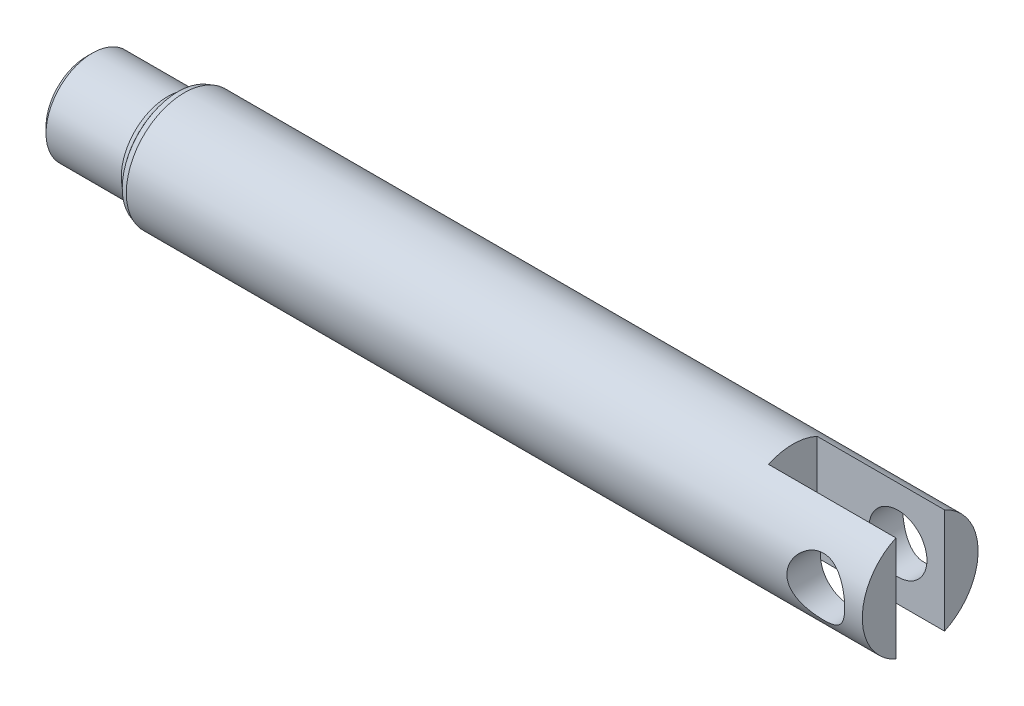
ISO-10303-21;
HEADER;
FILE_DESCRIPTION(('STEP AP214'),'2;1');
FILE_NAME('part.step','',(''),(''),'','','');
FILE_SCHEMA(('AUTOMOTIVE_DESIGN { 1 0 10303 214 1 1 1 1 }'));
ENDSEC;
DATA;
#1=APPLICATION_CONTEXT('core data for automotive mechanical design processes');
#2=APPLICATION_PROTOCOL_DEFINITION('international standard','automotive_design',2000,#1);
#3=PRODUCT_CONTEXT('',#1,'mechanical');
#4=PRODUCT('Part','Part','',(#3));
#5=PRODUCT_RELATED_PRODUCT_CATEGORY('part','',(#4));
#6=PRODUCT_DEFINITION_FORMATION('','',#4);
#7=PRODUCT_DEFINITION_CONTEXT('part definition',#1,'design');
#8=PRODUCT_DEFINITION('design','',#6,#7);
#9=PRODUCT_DEFINITION_SHAPE('','',#8);
#10=(LENGTH_UNIT() NAMED_UNIT(*) SI_UNIT(.MILLI.,.METRE.));
#11=(NAMED_UNIT(*) PLANE_ANGLE_UNIT() SI_UNIT($,.RADIAN.));
#12=(NAMED_UNIT(*) SI_UNIT($,.STERADIAN.) SOLID_ANGLE_UNIT());
#13=UNCERTAINTY_MEASURE_WITH_UNIT(LENGTH_MEASURE(1.E-05),#10,'distance_accuracy_value','');
#14=(GEOMETRIC_REPRESENTATION_CONTEXT(3) GLOBAL_UNCERTAINTY_ASSIGNED_CONTEXT((#13)) GLOBAL_UNIT_ASSIGNED_CONTEXT((#10,
#11,#12)) REPRESENTATION_CONTEXT('',''));
#15=CARTESIAN_POINT('',(0.,0.,0.));
#16=DIRECTION('',(0.,0.,1.));
#17=DIRECTION('',(1.,0.,0.));
#18=AXIS2_PLACEMENT_3D('',#15,#16,#17);
#19=CARTESIAN_POINT('',(18.,2.5,0.));
#20=DIRECTION('',(1.,0.,0.));
#21=DIRECTION('',(0.,0.,-1.));
#22=AXIS2_PLACEMENT_3D('',#19,#20,#21);
#23=PLANE('',#22);
#24=DIRECTION('',(0.,1.,0.));
#25=VECTOR('',#24,1.);
#26=CARTESIAN_POINT('',(18.,2.91201767904379,-1.05));
#27=LINE('',#26,#25);
#28=CARTESIAN_POINT('',(18.,-2.26881026090767,-1.05));
#29=VERTEX_POINT('',#28);
#30=CARTESIAN_POINT('',(18.,2.26881026090769,-1.05));
#31=VERTEX_POINT('',#30);
#32=EDGE_CURVE('E80',#29,#31,#27,.T.);
#33=ORIENTED_EDGE('',*,*,#32,.F.);
#34=CARTESIAN_POINT('',(18.,0.,0.));
#35=DIRECTION('',(1.,0.,0.));
#36=DIRECTION('',(0.,0.,-1.));
#37=AXIS2_PLACEMENT_3D('',#34,#35,#36);
#38=CIRCLE('',#37,2.49999999999999);
#39=EDGE_CURVE('E89',#29,#31,#38,.T.);
#40=ORIENTED_EDGE('',*,*,#39,.T.);
#41=EDGE_LOOP('',(#33,#40));
#42=FACE_BOUND('',#41,.T.);
#43=ADVANCED_FACE('F35',(#42),#23,.T.);
#44=CARTESIAN_POINT('',(-18.,0.,0.));
#45=DIRECTION('',(-1.,0.,0.));
#46=DIRECTION('',(0.,0.,1.));
#47=AXIS2_PLACEMENT_3D('',#44,#45,#46);
#48=PLANE('',#47);
#49=CARTESIAN_POINT('',(-18.,0.,0.));
#50=DIRECTION('',(-1.,0.,0.));
#51=DIRECTION('',(0.,0.,1.));
#52=AXIS2_PLACEMENT_3D('',#49,#50,#51);
#53=CIRCLE('',#52,1.75000000000001);
#54=CARTESIAN_POINT('',(-18.,0.,1.75000000000001));
#55=VERTEX_POINT('',#54);
#56=EDGE_CURVE('E118',#55,#55,#53,.T.);
#57=ORIENTED_EDGE('',*,*,#56,.T.);
#58=EDGE_LOOP('',(#57));
#59=FACE_BOUND('',#58,.T.);
#60=ADVANCED_FACE('F135',(#59),#48,.T.);
#61=DIRECTION('',(0.,-1.,0.));
#62=VECTOR('',#61,1.);
#63=CARTESIAN_POINT('',(18.,2.91201767904379,1.05));
#64=LINE('',#63,#62);
#65=CARTESIAN_POINT('',(18.,2.26881026090769,1.05));
#66=VERTEX_POINT('',#65);
#67=CARTESIAN_POINT('',(18.,-2.26881026090767,1.05));
#68=VERTEX_POINT('',#67);
#69=EDGE_CURVE('E90',#66,#68,#64,.T.);
#70=ORIENTED_EDGE('',*,*,#69,.F.);
#71=EDGE_CURVE('E96',#66,#68,#38,.T.);
#72=ORIENTED_EDGE('',*,*,#71,.T.);
#73=EDGE_LOOP('',(#70,#72));
#74=FACE_BOUND('',#73,.T.);
#75=ADVANCED_FACE('F137',(#74),#23,.T.);
#76=CARTESIAN_POINT('',(18.,0.,0.));
#77=DIRECTION('',(1.,0.,0.));
#78=DIRECTION('',(0.,0.,-1.));
#79=AXIS2_PLACEMENT_3D('',#76,#77,#78);
#80=CYLINDRICAL_SURFACE('',#79,2.49999999999999);
#81=CARTESIAN_POINT('',(-13.7818995414645,0.,0.));
#82=DIRECTION('',(-1.,0.,0.));
#83=DIRECTION('',(0.,0.,1.));
#84=AXIS2_PLACEMENT_3D('',#81,#82,#83);
#85=CIRCLE('',#84,2.49999999999999);
#86=CARTESIAN_POINT('',(-13.7818995414645,0.,2.49999999999999));
#87=VERTEX_POINT('',#86);
#88=EDGE_CURVE('E44',#87,#87,#85,.F.);
#89=ORIENTED_EDGE('',*,*,#88,.T.);
#90=EDGE_LOOP('',(#89));
#91=FACE_BOUND('',#90,.T.);
#92=CARTESIAN_POINT('',(17.2412222235193,0.,-2.49999999999999));
#93=CARTESIAN_POINT('',(17.2412180956199,-0.0657149536912331,-2.49999641755188));
#94=CARTESIAN_POINT('',(17.2360096321172,-0.131508249622541,-2.49738113774396));
#95=CARTESIAN_POINT('',(17.2154061230931,-0.261150294085531,-2.48717695046744));
#96=CARTESIAN_POINT('',(17.1999917322722,-0.32499510839188,-2.47957859786229));
#97=CARTESIAN_POINT('',(17.1597299627483,-0.448666931100718,-2.46020349254138));
#98=CARTESIAN_POINT('',(17.1349192432093,-0.508508503673975,-2.44844298971899));
#99=CARTESIAN_POINT('',(17.0767589468131,-0.623090771008206,-2.42182220644722));
#100=CARTESIAN_POINT('',(17.0434100432082,-0.677831867487562,-2.40696217041911));
#101=CARTESIAN_POINT('',(16.9668256616627,-0.784384772202399,-2.3744532282257));
#102=CARTESIAN_POINT('',(16.9231141244697,-0.83581901390264,-2.35668998909419));
#103=CARTESIAN_POINT('',(16.8280703744605,-0.930974306083722,-2.32074962808429));
#104=CARTESIAN_POINT('',(16.7767324088037,-0.974689478883458,-2.30257220261292));
#105=CARTESIAN_POINT('',(16.6631180366151,-1.05656500056285,-2.26623688996682));
#106=CARTESIAN_POINT('',(16.6003021005869,-1.09403166943955,-2.24818983712663));
#107=CARTESIAN_POINT('',(16.4682630535365,-1.15771028361337,-2.21607473465399));
#108=CARTESIAN_POINT('',(16.3990445626159,-1.18393026870792,-2.20200384508735));
#109=CARTESIAN_POINT('',(16.2603908417419,-1.22266555273574,-2.18072333797259));
#110=CARTESIAN_POINT('',(16.1912166584351,-1.23590732135055,-2.1731533947964));
#111=CARTESIAN_POINT('',(16.051248676295,-1.25053374163606,-2.16477362435658));
#112=CARTESIAN_POINT('',(15.9804565474304,-1.25193011046634,-2.16395711679109));
#113=CARTESIAN_POINT('',(15.8483646931251,-1.24335910896537,-2.16888662821559));
#114=CARTESIAN_POINT('',(15.7869421844905,-1.23473069942103,-2.17385954577515));
#115=CARTESIAN_POINT('',(15.666569836803,-1.20867481132117,-2.18845285917311));
#116=CARTESIAN_POINT('',(15.6076207918877,-1.19124452987207,-2.19807473539719));
#117=CARTESIAN_POINT('',(15.4921858078122,-1.14776222548251,-2.22109345515925));
#118=CARTESIAN_POINT('',(15.4357892250371,-1.12151883389499,-2.23457300829997));
#119=CARTESIAN_POINT('',(15.3279293577818,-1.061302109585,-2.26379255351753));
#120=CARTESIAN_POINT('',(15.2764683040192,-1.02732530476559,-2.27953355975237));
#121=CARTESIAN_POINT('',(15.1730706575903,-0.947582568640988,-2.31391447379106));
#122=CARTESIAN_POINT('',(15.1219011315491,-0.900868072961605,-2.33266887795931));
#123=CARTESIAN_POINT('',(15.0278029502807,-0.79944447342672,-2.36934529125508));
#124=CARTESIAN_POINT('',(14.9848782334769,-0.74473157071786,-2.387266899485));
#125=CARTESIAN_POINT('',(14.9066151472321,-0.625645632289814,-2.42127484103704));
#126=CARTESIAN_POINT('',(14.8717216329621,-0.560941989499264,-2.43723730202508));
#127=CARTESIAN_POINT('',(14.8136009372155,-0.425582769360999,-2.46447351401552));
#128=CARTESIAN_POINT('',(14.7903644922503,-0.354931970331599,-2.4757509867944));
#129=CARTESIAN_POINT('',(14.7581279688735,-0.21595811457588,-2.49155417176794));
#130=CARTESIAN_POINT('',(14.7481081788358,-0.147926913185408,-2.49656172876639));
#131=CARTESIAN_POINT('',(14.7393913096012,-0.010974499936694,-2.50091266823876));
#132=CARTESIAN_POINT('',(14.7406888664699,0.0579462748373751,-2.5002587340164));
#133=CARTESIAN_POINT('',(14.7539805840427,0.189041214982491,-2.493639903168));
#134=CARTESIAN_POINT('',(14.7651378894318,0.251324260062442,-2.48809057110236));
#135=CARTESIAN_POINT('',(14.7965198133882,0.373008615377395,-2.47277714143523));
#136=CARTESIAN_POINT('',(14.816745431586,0.432409607113745,-2.46301257917915));
#137=CARTESIAN_POINT('',(14.8662203065608,0.54861076056208,-2.43980314267086));
#138=CARTESIAN_POINT('',(14.8957110361653,0.605287996257691,-2.42626102212424));
#139=CARTESIAN_POINT('',(14.9626066430768,0.713076702123651,-2.39679967896386));
#140=CARTESIAN_POINT('',(15.0000148917611,0.764185787219102,-2.38087944457231));
#141=CARTESIAN_POINT('',(15.0859227551854,0.864709611613316,-2.3463527667183));
#142=CARTESIAN_POINT('',(15.1351508090863,0.913465097280798,-2.32763606060551));
#143=CARTESIAN_POINT('',(15.2411286626059,1.00232040139155,-2.29077989504843));
#144=CARTESIAN_POINT('',(15.2978836220398,1.04241423211355,-2.27264084226907));
#145=CARTESIAN_POINT('',(15.4207767912697,1.11463489312212,-2.23813990282585));
#146=CARTESIAN_POINT('',(15.48723630628,1.1462818698483,-2.2219066207934));
#147=CARTESIAN_POINT('',(15.6256098081349,1.19760353251725,-2.19467590460157));
#148=CARTESIAN_POINT('',(15.6975166316458,1.21729364485946,-2.18367172800772));
#149=CARTESIAN_POINT('',(15.8373600020961,1.2423271093121,-2.16951876260833));
#150=CARTESIAN_POINT('',(15.9050150403056,1.24886624550108,-2.16571729325614));
#151=CARTESIAN_POINT('',(16.0405310574827,1.25086144297599,-2.16456693307718));
#152=CARTESIAN_POINT('',(16.1083919344436,1.2463223082805,-2.1672152453444));
#153=CARTESIAN_POINT('',(16.2355766004343,1.22740765699033,-2.1779732756253));
#154=CARTESIAN_POINT('',(16.2950978111998,1.2140103929285,-2.18553868102991));
#155=CARTESIAN_POINT('',(16.4109823728002,1.17896919778081,-2.20463770234896));
#156=CARTESIAN_POINT('',(16.4673447011343,1.15732261394976,-2.21617259462094));
#157=CARTESIAN_POINT('',(16.5795032872525,1.10476968162586,-2.2428566295566));
#158=CARTESIAN_POINT('',(16.6350071008064,1.07333892227057,-2.25819652995238));
#159=CARTESIAN_POINT('',(16.740315393745,1.00268871454579,-2.29044164543237));
#160=CARTESIAN_POINT('',(16.7901168866674,0.963465214048311,-2.30734767243152));
#161=CARTESIAN_POINT('',(16.8888997014663,0.872754158330802,-2.34327903949141));
#162=CARTESIAN_POINT('',(16.9370461014717,0.820355528762715,-2.36231229139335));
#163=CARTESIAN_POINT('',(17.0240509527988,0.707693507775351,-2.39847190318859));
#164=CARTESIAN_POINT('',(17.0629043978022,0.647425904070984,-2.41559723260049));
#165=CARTESIAN_POINT('',(17.1302676769721,0.519914496024937,-2.44622511981378));
#166=CARTESIAN_POINT('',(17.1587024352836,0.452624379918271,-2.45970120703636));
#167=CARTESIAN_POINT('',(17.203482433418,0.313427626617743,-2.48126676704331));
#168=CARTESIAN_POINT('',(17.2198620320563,0.241534749528961,-2.48937154216164));
#169=CARTESIAN_POINT('',(17.2335939873641,0.140752433104233,-2.49619327387078));
#170=CARTESIAN_POINT('',(17.2364505245988,0.112702349299376,-2.49761706674001));
#171=CARTESIAN_POINT('',(17.2402655554153,0.0564396647589481,-2.4995212122233));
#172=CARTESIAN_POINT('',(17.2412239966083,0.0282270595592272,-2.50000153879703));
#173=CARTESIAN_POINT('',(17.2412222235193,0.,-2.49999999999999));
#174=B_SPLINE_CURVE_WITH_KNOTS('',3,(#92,#93,#94,#95,#96,#97,#98,#99,#100,#101,#102,#103,#104,
#105,#106,#107,#108,#109,#110,#111,#112,#113,#114,#115,#116,#117,#118,#119,#120,#121,#122,#123,
#124,#125,#126,#127,#128,#129,#130,#131,#132,#133,#134,#135,#136,#137,#138,#139,#140,#141,#142,
#143,#144,#145,#146,#147,#148,#149,#150,#151,#152,#153,#154,#155,#156,#157,#158,#159,#160,#161,
#162,#163,#164,#165,#166,#167,#168,#169,#170,#171,#172,#173),.UNSPECIFIED.,.T.,.F.,(4,2,2,2,2,2,
2,2,2,2,2,2,2,2,2,2,2,2,2,2,2,2,2,2,2,2,2,2,2,2,2,2,2,2,2,2,2,2,2,2,4),(0.,0.197030321775366,
0.394435187136497,0.591077694365373,0.78770470072696,0.996227198397612,1.20490779706755,
1.42977158038441,1.65447434872851,1.86572515175287,2.07676696661276,2.26257140511651,
2.44843504907098,2.63862800210609,2.82890651575277,3.04331176667348,3.25781918248358,
3.48228777768051,3.7065777114035,3.91229113089182,4.11790705639345,4.30758633132653,
4.49728652038665,4.69241070034874,4.88761813435424,5.10199513305524,5.3165198576929,
5.54143352699593,5.76605639925972,5.96911634372967,6.17208824825007,6.35572412805229,
6.53941910979598,6.73545570969518,6.93159451423698,7.15156553440624,7.37165479220716,
7.59330017078657,7.81431135781163,7.89894100172123,7.98357298143559),.UNSPECIFIED.);
#175=CARTESIAN_POINT('',(17.2412222235193,0.,-2.49999999999999));
#176=VERTEX_POINT('',#175);
#177=EDGE_CURVE('E91',#176,#176,#174,.T.);
#178=ORIENTED_EDGE('',*,*,#177,.F.);
#179=EDGE_LOOP('',(#178));
#180=FACE_BOUND('',#179,.T.);
#181=CARTESIAN_POINT('',(17.2412222235193,0.,2.49999999999999));
#182=CARTESIAN_POINT('',(17.2412180956199,0.065714953691243,2.49999641755188));
#183=CARTESIAN_POINT('',(17.2360096321172,0.13150824962255,2.49738113774396));
#184=CARTESIAN_POINT('',(17.2154061230931,0.261150294085541,2.48717695046744));
#185=CARTESIAN_POINT('',(17.1999917322722,0.324995108391889,2.47957859786229));
#186=CARTESIAN_POINT('',(17.1597299627483,0.448666931100728,2.46020349254139));
#187=CARTESIAN_POINT('',(17.1349192432093,0.508508503673985,2.44844298971899));
#188=CARTESIAN_POINT('',(17.0767589468131,0.623090771008216,2.42182220644722));
#189=CARTESIAN_POINT('',(17.0434100432082,0.677831867487572,2.40696217041912));
#190=CARTESIAN_POINT('',(16.9668256616627,0.784384772202407,2.3744532282257));
#191=CARTESIAN_POINT('',(16.9231141244697,0.835819013902648,2.35668998909419));
#192=CARTESIAN_POINT('',(16.8280703744605,0.930974306083729,2.3207496280843));
#193=CARTESIAN_POINT('',(16.7767324088037,0.974689478883466,2.30257220261293));
#194=CARTESIAN_POINT('',(16.6631180366151,1.05656500056286,2.26623688996683));
#195=CARTESIAN_POINT('',(16.6003021005869,1.09403166943955,2.24818983712664));
#196=CARTESIAN_POINT('',(16.4682630535365,1.15771028361337,2.216074734654));
#197=CARTESIAN_POINT('',(16.3990445626158,1.18393026870792,2.20200384508736));
#198=CARTESIAN_POINT('',(16.2603908417419,1.22266555273574,2.1807233379726));
#199=CARTESIAN_POINT('',(16.191216658435,1.23590732135055,2.17315339479641));
#200=CARTESIAN_POINT('',(16.0512486762949,1.25053374163606,2.16477362435659));
#201=CARTESIAN_POINT('',(15.9804565474303,1.25193011046634,2.1639571167911));
#202=CARTESIAN_POINT('',(15.8483646931251,1.24335910896537,2.1688866282156));
#203=CARTESIAN_POINT('',(15.7869421844905,1.23473069942103,2.17385954577517));
#204=CARTESIAN_POINT('',(15.666569836803,1.20867481132116,2.18845285917313));
#205=CARTESIAN_POINT('',(15.6076207918876,1.19124452987206,2.1980747353972));
#206=CARTESIAN_POINT('',(15.4921858078122,1.1477622254825,2.22109345515926));
#207=CARTESIAN_POINT('',(15.4357892250371,1.12151883389499,2.23457300829998));
#208=CARTESIAN_POINT('',(15.3279293577818,1.061302109585,2.26379255351754));
#209=CARTESIAN_POINT('',(15.2764683040192,1.02732530476558,2.27953355975238));
#210=CARTESIAN_POINT('',(15.1730706575903,0.94758256864098,2.31391447379107));
#211=CARTESIAN_POINT('',(15.1219011315491,0.900868072961596,2.33266887795932));
#212=CARTESIAN_POINT('',(15.0278029502807,0.799444473426709,2.36934529125509));
#213=CARTESIAN_POINT('',(14.9848782334769,0.744731570717849,2.38726689948501));
#214=CARTESIAN_POINT('',(14.9066151472321,0.625645632289801,2.42127484103704));
#215=CARTESIAN_POINT('',(14.8717216329621,0.560941989499251,2.43723730202509));
#216=CARTESIAN_POINT('',(14.8136009372155,0.425582769360986,2.46447351401552));
#217=CARTESIAN_POINT('',(14.7903644922503,0.354931970331586,2.4757509867944));
#218=CARTESIAN_POINT('',(14.7581279688734,0.215958114575868,2.49155417176794));
#219=CARTESIAN_POINT('',(14.7481081788358,0.147926913185396,2.49656172876639));
#220=CARTESIAN_POINT('',(14.7393913096012,0.0109744999366832,2.50091266823876));
#221=CARTESIAN_POINT('',(14.7406888664699,-0.0579462748373853,2.50025873401639));
#222=CARTESIAN_POINT('',(14.7539805840427,-0.1890412149825,2.493639903168));
#223=CARTESIAN_POINT('',(14.7651378894318,-0.251324260062451,2.48809057110236));
#224=CARTESIAN_POINT('',(14.7965198133882,-0.373008615377404,2.47277714143523));
#225=CARTESIAN_POINT('',(14.816745431586,-0.432409607113753,2.46301257917914));
#226=CARTESIAN_POINT('',(14.8662203065608,-0.548610760562088,2.43980314267086));
#227=CARTESIAN_POINT('',(14.8957110361653,-0.605287996257699,2.42626102212423));
#228=CARTESIAN_POINT('',(14.9626066430769,-0.713076702123658,2.39679967896385));
#229=CARTESIAN_POINT('',(15.0000148917611,-0.764185787219109,2.3808794445723));
#230=CARTESIAN_POINT('',(15.0859227551854,-0.864709611613323,2.34635276671829));
#231=CARTESIAN_POINT('',(15.1351508090863,-0.913465097280805,2.3276360606055));
#232=CARTESIAN_POINT('',(15.2411286626059,-1.00232040139156,2.29077989504841));
#233=CARTESIAN_POINT('',(15.2978836220398,-1.04241423211356,2.27264084226906));
#234=CARTESIAN_POINT('',(15.4207767912697,-1.11463489312212,2.23813990282583));
#235=CARTESIAN_POINT('',(15.48723630628,-1.1462818698483,2.22190662079338));
#236=CARTESIAN_POINT('',(15.625609808135,-1.19760353251726,2.19467590460156));
#237=CARTESIAN_POINT('',(15.6975166316458,-1.21729364485947,2.18367172800771));
#238=CARTESIAN_POINT('',(15.8373600020961,-1.2423271093121,2.16951876260832));
#239=CARTESIAN_POINT('',(15.9050150403056,-1.24886624550108,2.16571729325612));
#240=CARTESIAN_POINT('',(16.0405310574827,-1.25086144297598,2.16456693307717));
#241=CARTESIAN_POINT('',(16.1083919344436,-1.2463223082805,2.16721524534439));
#242=CARTESIAN_POINT('',(16.2355766004343,-1.22740765699033,2.17797327562529));
#243=CARTESIAN_POINT('',(16.2950978111998,-1.2140103929285,2.18553868102991));
#244=CARTESIAN_POINT('',(16.4109823728002,-1.1789691977808,2.20463770234896));
#245=CARTESIAN_POINT('',(16.4673447011343,-1.15732261394976,2.21617259462093));
#246=CARTESIAN_POINT('',(16.5795032872526,-1.10476968162585,2.24285662955659));
#247=CARTESIAN_POINT('',(16.6350071008064,-1.07333892227057,2.25819652995237));
#248=CARTESIAN_POINT('',(16.740315393745,-1.00268871454579,2.29044164543236));
#249=CARTESIAN_POINT('',(16.7901168866674,-0.963465214048308,2.30734767243151));
#250=CARTESIAN_POINT('',(16.8888997014663,-0.872754158330799,2.3432790394914));
#251=CARTESIAN_POINT('',(16.9370461014717,-0.820355528762711,2.36231229139335));
#252=CARTESIAN_POINT('',(17.0240509527988,-0.707693507775346,2.39847190318859));
#253=CARTESIAN_POINT('',(17.0629043978022,-0.647425904070978,2.41559723260049));
#254=CARTESIAN_POINT('',(17.1302676769721,-0.519914496024929,2.44622511981378));
#255=CARTESIAN_POINT('',(17.1587024352836,-0.452624379918262,2.45970120703635));
#256=CARTESIAN_POINT('',(17.203482433418,-0.313427626617732,2.48126676704331));
#257=CARTESIAN_POINT('',(17.2198620320563,-0.24153474952895,2.48937154216164));
#258=CARTESIAN_POINT('',(17.2335939873641,-0.140752433104222,2.49619327387078));
#259=CARTESIAN_POINT('',(17.2364505245988,-0.112702349299365,2.49761706674001));
#260=CARTESIAN_POINT('',(17.2402655554153,-0.0564396647589379,2.4995212122233));
#261=CARTESIAN_POINT('',(17.2412239966083,-0.0282270595592172,2.50000153879703));
#262=CARTESIAN_POINT('',(17.2412222235193,0.,2.49999999999999));
#263=B_SPLINE_CURVE_WITH_KNOTS('',3,(#181,#182,#183,#184,#185,#186,#187,#188,#189,#190,#191,
#192,#193,#194,#195,#196,#197,#198,#199,#200,#201,#202,#203,#204,#205,#206,#207,#208,#209,#210,
#211,#212,#213,#214,#215,#216,#217,#218,#219,#220,#221,#222,#223,#224,#225,#226,#227,#228,#229,
#230,#231,#232,#233,#234,#235,#236,#237,#238,#239,#240,#241,#242,#243,#244,#245,#246,#247,#248,
#249,#250,#251,#252,#253,#254,#255,#256,#257,#258,#259,#260,#261,#262),.UNSPECIFIED.,.T.,.F.,(4,
2,2,2,2,2,2,2,2,2,2,2,2,2,2,2,2,2,2,2,2,2,2,2,2,2,2,2,2,2,2,2,2,2,2,2,2,2,2,2,4),(0.,
0.197030321775366,0.394435187136497,0.591077694365374,0.78770470072696,0.996227198397612,
1.20490779706755,1.42977158038441,1.65447434872852,1.86572515175287,2.07676696661276,
2.26257140511651,2.44843504907098,2.63862800210609,2.82890651575277,3.04331176667348,
3.25781918248358,3.48228777768051,3.7065777114035,3.91229113089182,4.11790705639345,
4.30758633132653,4.49728652038664,4.69241070034873,4.88761813435424,5.10199513305524,
5.3165198576929,5.54143352699593,5.76605639925973,5.96911634372967,6.17208824825007,
6.35572412805229,6.53941910979598,6.73545570969518,6.93159451423697,7.15156553440623,
7.37165479220716,7.59330017078657,7.81431135781163,7.89894100172123,7.98357298143559),.UNSPECIFIED.);
#264=CARTESIAN_POINT('',(17.2412222235193,0.,2.49999999999999));
#265=VERTEX_POINT('',#264);
#266=EDGE_CURVE('E163',#265,#265,#263,.T.);
#267=ORIENTED_EDGE('',*,*,#266,.F.);
#268=EDGE_LOOP('',(#267));
#269=FACE_BOUND('',#268,.T.);
#270=DIRECTION('',(1.,0.,0.));
#271=VECTOR('',#270,1.);
#272=CARTESIAN_POINT('',(18.,-2.26881026090767,-1.05));
#273=LINE('',#272,#271);
#274=CARTESIAN_POINT('',(12.5,-2.26881026090767,-1.05));
#275=VERTEX_POINT('',#274);
#276=EDGE_CURVE('E77',#275,#29,#273,.T.);
#277=ORIENTED_EDGE('',*,*,#276,.F.);
#278=CARTESIAN_POINT('',(12.5,0.,0.));
#279=DIRECTION('',(1.,0.,0.));
#280=DIRECTION('',(0.,0.,-1.));
#281=AXIS2_PLACEMENT_3D('',#278,#279,#280);
#282=CIRCLE('',#281,2.49999999999999);
#283=CARTESIAN_POINT('',(12.5,-2.26881026090767,1.05));
#284=VERTEX_POINT('',#283);
#285=EDGE_CURVE('E108',#275,#284,#282,.F.);
#286=ORIENTED_EDGE('',*,*,#285,.T.);
#287=DIRECTION('',(1.,0.,0.));
#288=VECTOR('',#287,1.);
#289=CARTESIAN_POINT('',(18.,-2.26881026090767,1.05));
#290=LINE('',#289,#288);
#291=EDGE_CURVE('E59',#68,#284,#290,.F.);
#292=ORIENTED_EDGE('',*,*,#291,.F.);
#293=ORIENTED_EDGE('',*,*,#71,.F.);
#294=DIRECTION('',(1.,0.,0.));
#295=VECTOR('',#294,1.);
#296=CARTESIAN_POINT('',(18.,2.26881026090769,1.05));
#297=LINE('',#296,#295);
#298=CARTESIAN_POINT('',(12.5,2.26881026090769,1.05));
#299=VERTEX_POINT('',#298);
#300=EDGE_CURVE('E107',#299,#66,#297,.T.);
#301=ORIENTED_EDGE('',*,*,#300,.F.);
#302=CARTESIAN_POINT('',(12.5,2.26881026090769,-1.05));
#303=VERTEX_POINT('',#302);
#304=EDGE_CURVE('E100',#299,#303,#282,.F.);
#305=ORIENTED_EDGE('',*,*,#304,.T.);
#306=DIRECTION('',(1.,0.,0.));
#307=VECTOR('',#306,1.);
#308=CARTESIAN_POINT('',(18.,2.26881026090769,-1.05));
#309=LINE('',#308,#307);
#310=EDGE_CURVE('E95',#31,#303,#309,.F.);
#311=ORIENTED_EDGE('',*,*,#310,.F.);
#312=ORIENTED_EDGE('',*,*,#39,.F.);
#313=EDGE_LOOP('',(#277,#286,#292,#293,#301,#305,#311,#312));
#314=FACE_BOUND('',#313,.T.);
#315=ADVANCED_FACE('F93',(#91,#180,#269,#314),#80,.T.);
#316=CARTESIAN_POINT('',(-14.9794502211714,0.,0.));
#317=DIRECTION('',(1.,0.,0.));
#318=DIRECTION('',(0.,0.,-1.));
#319=AXIS2_PLACEMENT_3D('',#316,#317,#318);
#320=TOROIDAL_SURFACE('',#319,2.97945022117141,1.0905022926771);
#321=CARTESIAN_POINT('',(-14.0507540326573,0.,0.));
#322=DIRECTION('',(-1.,0.,0.));
#323=DIRECTION('',(0.,0.,1.));
#324=AXIS2_PLACEMENT_3D('',#321,#322,#323);
#325=CIRCLE('',#324,2.40785714933331);
#326=CARTESIAN_POINT('',(-14.0507540326573,0.,2.40785714933331));
#327=VERTEX_POINT('',#326);
#328=EDGE_CURVE('E11',#327,#327,#325,.T.);
#329=ORIENTED_EDGE('',*,*,#328,.T.);
#330=EDGE_LOOP('',(#329));
#331=FACE_BOUND('',#330,.T.);
#332=CARTESIAN_POINT('',(-14.5,0.,0.));
#333=DIRECTION('',(1.,0.,0.));
#334=DIRECTION('',(0.,0.,-1.));
#335=AXIS2_PLACEMENT_3D('',#332,#333,#334);
#336=CIRCLE('',#335,2.);
#337=CARTESIAN_POINT('',(-14.5,0.,-2.));
#338=VERTEX_POINT('',#337);
#339=EDGE_CURVE('E97',#338,#338,#336,.T.);
#340=ORIENTED_EDGE('',*,*,#339,.T.);
#341=EDGE_LOOP('',(#340));
#342=FACE_BOUND('',#341,.T.);
#343=ADVANCED_FACE('F149',(#331,#342),#320,.F.);
#344=CARTESIAN_POINT('',(18.,0.,0.));
#345=DIRECTION('',(1.,0.,0.));
#346=DIRECTION('',(0.,0.,-1.));
#347=AXIS2_PLACEMENT_3D('',#344,#345,#346);
#348=CYLINDRICAL_SURFACE('',#347,2.);
#349=CARTESIAN_POINT('',(-17.75,0.,0.));
#350=DIRECTION('',(-1.,0.,0.));
#351=DIRECTION('',(0.,0.,1.));
#352=AXIS2_PLACEMENT_3D('',#349,#350,#351);
#353=CIRCLE('',#352,2.);
#354=CARTESIAN_POINT('',(-17.75,0.,2.));
#355=VERTEX_POINT('',#354);
#356=EDGE_CURVE('E85',#355,#355,#353,.F.);
#357=ORIENTED_EDGE('',*,*,#356,.T.);
#358=EDGE_LOOP('',(#357));
#359=FACE_BOUND('',#358,.T.);
#360=ORIENTED_EDGE('',*,*,#339,.F.);
#361=EDGE_LOOP('',(#360));
#362=FACE_BOUND('',#361,.T.);
#363=ADVANCED_FACE('F184',(#359,#362),#348,.T.);
#364=CARTESIAN_POINT('',(12.5,2.91201767904379,-1.05));
#365=DIRECTION('',(0.,0.,-1.));
#366=DIRECTION('',(0.,1.,0.));
#367=AXIS2_PLACEMENT_3D('',#364,#365,#366);
#368=PLANE('',#367);
#369=CARTESIAN_POINT('',(15.9912222235193,0.,-1.05));
#370=DIRECTION('',(0.,0.,-1.));
#371=DIRECTION('',(0.,1.,0.));
#372=AXIS2_PLACEMENT_3D('',#369,#370,#371);
#373=CIRCLE('',#372,1.25);
#374=CARTESIAN_POINT('',(15.9912222235193,1.25,-1.05));
#375=VERTEX_POINT('',#374);
#376=EDGE_CURVE('E115',#375,#375,#373,.T.);
#377=ORIENTED_EDGE('',*,*,#376,.T.);
#378=EDGE_LOOP('',(#377));
#379=FACE_BOUND('',#378,.T.);
#380=ORIENTED_EDGE('',*,*,#310,.T.);
#381=DIRECTION('',(0.,1.,0.));
#382=VECTOR('',#381,1.);
#383=CARTESIAN_POINT('',(12.5,2.91201767904379,-1.05));
#384=LINE('',#383,#382);
#385=EDGE_CURVE('E51',#275,#303,#384,.T.);
#386=ORIENTED_EDGE('',*,*,#385,.F.);
#387=ORIENTED_EDGE('',*,*,#276,.T.);
#388=ORIENTED_EDGE('',*,*,#32,.T.);
#389=EDGE_LOOP('',(#380,#386,#387,#388));
#390=FACE_BOUND('',#389,.T.);
#391=ADVANCED_FACE('F79',(#379,#390),#368,.F.);
#392=CARTESIAN_POINT('',(12.5,2.91201767904379,1.05));
#393=DIRECTION('',(0.,0.,1.));
#394=DIRECTION('',(0.,-1.,0.));
#395=AXIS2_PLACEMENT_3D('',#392,#393,#394);
#396=PLANE('',#395);
#397=CARTESIAN_POINT('',(15.9912222235193,0.,1.05));
#398=DIRECTION('',(0.,0.,1.));
#399=DIRECTION('',(0.,-1.,0.));
#400=AXIS2_PLACEMENT_3D('',#397,#398,#399);
#401=CIRCLE('',#400,1.25);
#402=CARTESIAN_POINT('',(15.9912222235193,-1.25,1.05));
#403=VERTEX_POINT('',#402);
#404=EDGE_CURVE('E112',#403,#403,#401,.T.);
#405=ORIENTED_EDGE('',*,*,#404,.T.);
#406=EDGE_LOOP('',(#405));
#407=FACE_BOUND('',#406,.T.);
#408=ORIENTED_EDGE('',*,*,#291,.T.);
#409=DIRECTION('',(0.,-1.,0.));
#410=VECTOR('',#409,1.);
#411=CARTESIAN_POINT('',(12.5,2.91201767904379,1.05));
#412=LINE('',#411,#410);
#413=EDGE_CURVE('E102',#299,#284,#412,.T.);
#414=ORIENTED_EDGE('',*,*,#413,.F.);
#415=ORIENTED_EDGE('',*,*,#300,.T.);
#416=ORIENTED_EDGE('',*,*,#69,.T.);
#417=EDGE_LOOP('',(#408,#414,#415,#416));
#418=FACE_BOUND('',#417,.T.);
#419=ADVANCED_FACE('F178',(#407,#418),#396,.F.);
#420=CARTESIAN_POINT('',(12.5,0.,0.));
#421=DIRECTION('',(1.,0.,0.));
#422=DIRECTION('',(0.,0.,-1.));
#423=AXIS2_PLACEMENT_3D('',#420,#421,#422);
#424=PLANE('',#423);
#425=ORIENTED_EDGE('',*,*,#385,.T.);
#426=ORIENTED_EDGE('',*,*,#304,.F.);
#427=ORIENTED_EDGE('',*,*,#413,.T.);
#428=ORIENTED_EDGE('',*,*,#285,.F.);
#429=EDGE_LOOP('',(#425,#426,#427,#428));
#430=FACE_BOUND('',#429,.T.);
#431=ADVANCED_FACE('F153',(#430),#424,.T.);
#432=CARTESIAN_POINT('',(15.9912222235193,0.,-2.49999999999999));
#433=DIRECTION('',(0.,0.,1.));
#434=DIRECTION('',(1.,0.,0.));
#435=AXIS2_PLACEMENT_3D('',#432,#433,#434);
#436=CYLINDRICAL_SURFACE('',#435,1.25);
#437=ORIENTED_EDGE('',*,*,#266,.T.);
#438=EDGE_LOOP('',(#437));
#439=FACE_BOUND('',#438,.T.);
#440=ORIENTED_EDGE('',*,*,#404,.F.);
#441=EDGE_LOOP('',(#440));
#442=FACE_BOUND('',#441,.T.);
#443=ADVANCED_FACE('F173',(#439,#442),#436,.F.);
#444=ORIENTED_EDGE('',*,*,#177,.T.);
#445=EDGE_LOOP('',(#444));
#446=FACE_BOUND('',#445,.T.);
#447=ORIENTED_EDGE('',*,*,#376,.F.);
#448=EDGE_LOOP('',(#447));
#449=FACE_BOUND('',#448,.T.);
#450=ADVANCED_FACE('F131',(#446,#449),#436,.F.);
#451=CARTESIAN_POINT('',(-17.75,0.,0.));
#452=DIRECTION('',(1.,0.,0.));
#453=DIRECTION('',(0.,0.,-1.));
#454=AXIS2_PLACEMENT_3D('',#451,#452,#453);
#455=CONICAL_SURFACE('',#454,2.,0.785398163397437);
#456=ORIENTED_EDGE('',*,*,#56,.F.);
#457=EDGE_LOOP('',(#456));
#458=FACE_BOUND('',#457,.T.);
#459=ORIENTED_EDGE('',*,*,#356,.F.);
#460=EDGE_LOOP('',(#459));
#461=FACE_BOUND('',#460,.T.);
#462=ADVANCED_FACE('F126',(#458,#461),#455,.T.);
#463=CARTESIAN_POINT('',(-13.7818995414645,0.,0.));
#464=DIRECTION('',(1.,0.,0.));
#465=DIRECTION('',(0.,0.,-1.));
#466=AXIS2_PLACEMENT_3D('',#463,#464,#465);
#467=CONICAL_SURFACE('',#466,2.49999999999999,0.330178092169898);
#468=ORIENTED_EDGE('',*,*,#328,.F.);
#469=EDGE_LOOP('',(#468));
#470=FACE_BOUND('',#469,.T.);
#471=ORIENTED_EDGE('',*,*,#88,.F.);
#472=EDGE_LOOP('',(#471));
#473=FACE_BOUND('',#472,.T.);
#474=ADVANCED_FACE('F38',(#470,#473),#467,.T.);
#475=CLOSED_SHELL('',(#43,#60,#75,#315,#343,#363,#391,#419,#431,#443,#450,#462,#474));
#476=MANIFOLD_SOLID_BREP('B2',#475);
#477=ADVANCED_BREP_SHAPE_REPRESENTATION('',(#18,#476),#14);
#478=SHAPE_DEFINITION_REPRESENTATION(#9,#477);
ENDSEC;
END-ISO-10303-21;
